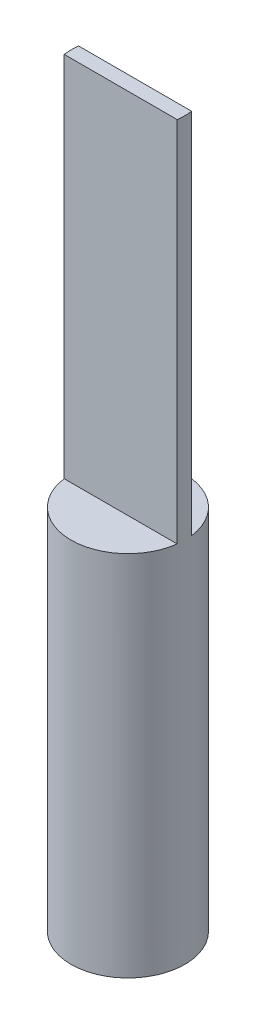
ISO-10303-21;
HEADER;
FILE_DESCRIPTION(('STEP AP214'),'2;1');
FILE_NAME('part.step','',(''),(''),'','','');
FILE_SCHEMA(('AUTOMOTIVE_DESIGN { 1 0 10303 214 1 1 1 1 }'));
ENDSEC;
DATA;
#1=APPLICATION_CONTEXT('core data for automotive mechanical design processes');
#2=APPLICATION_PROTOCOL_DEFINITION('international standard','automotive_design',2000,#1);
#3=PRODUCT_CONTEXT('',#1,'mechanical');
#4=PRODUCT('Part','Part','',(#3));
#5=PRODUCT_RELATED_PRODUCT_CATEGORY('part','',(#4));
#6=PRODUCT_DEFINITION_FORMATION('','',#4);
#7=PRODUCT_DEFINITION_CONTEXT('part definition',#1,'design');
#8=PRODUCT_DEFINITION('design','',#6,#7);
#9=PRODUCT_DEFINITION_SHAPE('','',#8);
#10=(LENGTH_UNIT() NAMED_UNIT(*) SI_UNIT(.MILLI.,.METRE.));
#11=(NAMED_UNIT(*) PLANE_ANGLE_UNIT() SI_UNIT($,.RADIAN.));
#12=(NAMED_UNIT(*) SI_UNIT($,.STERADIAN.) SOLID_ANGLE_UNIT());
#13=UNCERTAINTY_MEASURE_WITH_UNIT(LENGTH_MEASURE(1.E-05),#10,'distance_accuracy_value','');
#14=(GEOMETRIC_REPRESENTATION_CONTEXT(3) GLOBAL_UNCERTAINTY_ASSIGNED_CONTEXT((#13)) GLOBAL_UNIT_ASSIGNED_CONTEXT((#10,
#11,#12)) REPRESENTATION_CONTEXT('',''));
#15=CARTESIAN_POINT('',(0.,0.,0.));
#16=DIRECTION('',(0.,0.,1.));
#17=DIRECTION('',(1.,0.,0.));
#18=AXIS2_PLACEMENT_3D('',#15,#16,#17);
#19=CARTESIAN_POINT('',(0.,50.8,0.));
#20=DIRECTION('',(0.,-1.,0.));
#21=DIRECTION('',(0.,0.,-1.));
#22=AXIS2_PLACEMENT_3D('',#19,#20,#21);
#23=CYLINDRICAL_SURFACE('',#22,3.937);
#24=CARTESIAN_POINT('',(0.,50.8,0.));
#25=DIRECTION('',(0.,1.,0.));
#26=DIRECTION('',(0.,0.,1.));
#27=AXIS2_PLACEMENT_3D('',#24,#25,#26);
#28=CIRCLE('',#27,3.937);
#29=CARTESIAN_POINT('',(3.90512086880803,50.8,0.5));
#30=VERTEX_POINT('',#29);
#31=CARTESIAN_POINT('',(3.90512086880803,50.8,-0.5));
#32=VERTEX_POINT('',#31);
#33=EDGE_CURVE('E87',#30,#32,#28,.T.);
#34=ORIENTED_EDGE('',*,*,#33,.F.);
#35=DIRECTION('',(0.,-1.,0.));
#36=VECTOR('',#35,1.);
#37=CARTESIAN_POINT('',(3.90512086880803,50.8,0.5));
#38=LINE('',#37,#36);
#39=CARTESIAN_POINT('',(3.90512086880803,25.4,0.5));
#40=VERTEX_POINT('',#39);
#41=EDGE_CURVE('E45',#30,#40,#38,.T.);
#42=ORIENTED_EDGE('',*,*,#41,.T.);
#43=CARTESIAN_POINT('',(0.,25.4,0.));
#44=DIRECTION('',(0.,1.,0.));
#45=DIRECTION('',(0.,0.,1.));
#46=AXIS2_PLACEMENT_3D('',#43,#44,#45);
#47=CIRCLE('',#46,3.937);
#48=CARTESIAN_POINT('',(-3.90512086880803,25.4,0.5));
#49=VERTEX_POINT('',#48);
#50=EDGE_CURVE('E11',#49,#40,#47,.T.);
#51=ORIENTED_EDGE('',*,*,#50,.F.);
#52=DIRECTION('',(0.,-1.,0.));
#53=VECTOR('',#52,1.);
#54=CARTESIAN_POINT('',(-3.90512086880803,50.8,0.5));
#55=LINE('',#54,#53);
#56=CARTESIAN_POINT('',(-3.90512086880803,50.8,0.5));
#57=VERTEX_POINT('',#56);
#58=EDGE_CURVE('E72',#49,#57,#55,.F.);
#59=ORIENTED_EDGE('',*,*,#58,.T.);
#60=CARTESIAN_POINT('',(-3.90512086880803,50.8,-0.5));
#61=VERTEX_POINT('',#60);
#62=EDGE_CURVE('E82',#61,#57,#28,.T.);
#63=ORIENTED_EDGE('',*,*,#62,.F.);
#64=DIRECTION('',(0.,-1.,0.));
#65=VECTOR('',#64,1.);
#66=CARTESIAN_POINT('',(-3.90512086880803,50.8,-0.5));
#67=LINE('',#66,#65);
#68=CARTESIAN_POINT('',(-3.90512086880803,25.4,-0.5));
#69=VERTEX_POINT('',#68);
#70=EDGE_CURVE('E53',#61,#69,#67,.T.);
#71=ORIENTED_EDGE('',*,*,#70,.T.);
#72=CARTESIAN_POINT('',(0.,25.4,0.));
#73=DIRECTION('',(0.,1.,0.));
#74=DIRECTION('',(0.,0.,1.));
#75=AXIS2_PLACEMENT_3D('',#72,#73,#74);
#76=CIRCLE('',#75,3.937);
#77=CARTESIAN_POINT('',(3.90512086880803,25.4,-0.5));
#78=VERTEX_POINT('',#77);
#79=EDGE_CURVE('E77',#78,#69,#76,.T.);
#80=ORIENTED_EDGE('',*,*,#79,.F.);
#81=DIRECTION('',(0.,-1.,0.));
#82=VECTOR('',#81,1.);
#83=CARTESIAN_POINT('',(3.90512086880803,50.8,-0.5));
#84=LINE('',#83,#82);
#85=EDGE_CURVE('E103',#78,#32,#84,.F.);
#86=ORIENTED_EDGE('',*,*,#85,.T.);
#87=EDGE_LOOP('',(#34,#42,#51,#59,#63,#71,#80,#86));
#88=FACE_BOUND('',#87,.T.);
#89=CARTESIAN_POINT('',(0.,0.,0.));
#90=DIRECTION('',(0.,1.,0.));
#91=DIRECTION('',(0.,0.,1.));
#92=AXIS2_PLACEMENT_3D('',#89,#90,#91);
#93=CIRCLE('',#92,3.937);
#94=CARTESIAN_POINT('',(0.,0.,3.937));
#95=VERTEX_POINT('',#94);
#96=EDGE_CURVE('E90',#95,#95,#93,.T.);
#97=ORIENTED_EDGE('',*,*,#96,.T.);
#98=EDGE_LOOP('',(#97));
#99=FACE_BOUND('',#98,.T.);
#100=ADVANCED_FACE('F31',(#88,#99),#23,.T.);
#101=CARTESIAN_POINT('',(0.,50.8,0.));
#102=DIRECTION('',(0.,1.,0.));
#103=DIRECTION('',(0.,0.,1.));
#104=AXIS2_PLACEMENT_3D('',#101,#102,#103);
#105=PLANE('',#104);
#106=DIRECTION('',(-1.,0.,0.));
#107=VECTOR('',#106,1.);
#108=CARTESIAN_POINT('',(0.,50.8,0.5));
#109=LINE('',#108,#107);
#110=EDGE_CURVE('E38',#30,#57,#109,.T.);
#111=ORIENTED_EDGE('',*,*,#110,.F.);
#112=ORIENTED_EDGE('',*,*,#33,.T.);
#113=DIRECTION('',(1.,0.,0.));
#114=VECTOR('',#113,1.);
#115=CARTESIAN_POINT('',(0.,50.8,-0.5));
#116=LINE('',#115,#114);
#117=EDGE_CURVE('E86',#61,#32,#116,.T.);
#118=ORIENTED_EDGE('',*,*,#117,.F.);
#119=ORIENTED_EDGE('',*,*,#62,.T.);
#120=EDGE_LOOP('',(#111,#112,#118,#119));
#121=FACE_BOUND('',#120,.T.);
#122=ADVANCED_FACE('F85',(#121),#105,.T.);
#123=CARTESIAN_POINT('',(0.,0.,0.));
#124=DIRECTION('',(0.,1.,0.));
#125=DIRECTION('',(0.,0.,1.));
#126=AXIS2_PLACEMENT_3D('',#123,#124,#125);
#127=PLANE('',#126);
#128=ORIENTED_EDGE('',*,*,#96,.F.);
#129=EDGE_LOOP('',(#128));
#130=FACE_BOUND('',#129,.T.);
#131=ADVANCED_FACE('F121',(#130),#127,.F.);
#132=CARTESIAN_POINT('',(-4.85777929706264,25.4,-0.5));
#133=DIRECTION('',(0.,1.,0.));
#134=DIRECTION('',(0.,0.,1.));
#135=AXIS2_PLACEMENT_3D('',#132,#133,#134);
#136=PLANE('',#135);
#137=ORIENTED_EDGE('',*,*,#79,.T.);
#138=DIRECTION('',(1.,0.,0.));
#139=VECTOR('',#138,1.);
#140=CARTESIAN_POINT('',(-4.85777929706264,25.4,-0.5));
#141=LINE('',#140,#139);
#142=EDGE_CURVE('E100',#69,#78,#141,.T.);
#143=ORIENTED_EDGE('',*,*,#142,.T.);
#144=EDGE_LOOP('',(#137,#143));
#145=FACE_BOUND('',#144,.T.);
#146=ADVANCED_FACE('F99',(#145),#136,.T.);
#147=CARTESIAN_POINT('',(-4.85777929706264,25.4,-0.5));
#148=DIRECTION('',(0.,0.,1.));
#149=DIRECTION('',(1.,0.,0.));
#150=AXIS2_PLACEMENT_3D('',#147,#148,#149);
#151=PLANE('',#150);
#152=ORIENTED_EDGE('',*,*,#117,.T.);
#153=ORIENTED_EDGE('',*,*,#85,.F.);
#154=ORIENTED_EDGE('',*,*,#142,.F.);
#155=ORIENTED_EDGE('',*,*,#70,.F.);
#156=EDGE_LOOP('',(#152,#153,#154,#155));
#157=FACE_BOUND('',#156,.T.);
#158=ADVANCED_FACE('F102',(#157),#151,.F.);
#159=CARTESIAN_POINT('',(5.47521666566125,25.4,4.24488190911566));
#160=DIRECTION('',(0.,1.,0.));
#161=DIRECTION('',(0.,0.,1.));
#162=AXIS2_PLACEMENT_3D('',#159,#160,#161);
#163=PLANE('',#162);
#164=ORIENTED_EDGE('',*,*,#50,.T.);
#165=DIRECTION('',(-1.,0.,0.));
#166=VECTOR('',#165,1.);
#167=CARTESIAN_POINT('',(-4.85777929706264,25.4,0.5));
#168=LINE('',#167,#166);
#169=EDGE_CURVE('E83',#40,#49,#168,.T.);
#170=ORIENTED_EDGE('',*,*,#169,.T.);
#171=EDGE_LOOP('',(#164,#170));
#172=FACE_BOUND('',#171,.T.);
#173=ADVANCED_FACE('F108',(#172),#163,.T.);
#174=CARTESIAN_POINT('',(-4.85777929706264,25.4,0.5));
#175=DIRECTION('',(0.,0.,-1.));
#176=DIRECTION('',(-1.,0.,0.));
#177=AXIS2_PLACEMENT_3D('',#174,#175,#176);
#178=PLANE('',#177);
#179=ORIENTED_EDGE('',*,*,#110,.T.);
#180=ORIENTED_EDGE('',*,*,#58,.F.);
#181=ORIENTED_EDGE('',*,*,#169,.F.);
#182=ORIENTED_EDGE('',*,*,#41,.F.);
#183=EDGE_LOOP('',(#179,#180,#181,#182));
#184=FACE_BOUND('',#183,.T.);
#185=ADVANCED_FACE('F71',(#184),#178,.F.);
#186=CLOSED_SHELL('',(#100,#122,#131,#146,#158,#173,#185));
#187=MANIFOLD_SOLID_BREP('B2',#186);
#188=ADVANCED_BREP_SHAPE_REPRESENTATION('',(#18,#187),#14);
#189=SHAPE_DEFINITION_REPRESENTATION(#9,#188);
ENDSEC;
END-ISO-10303-21;
